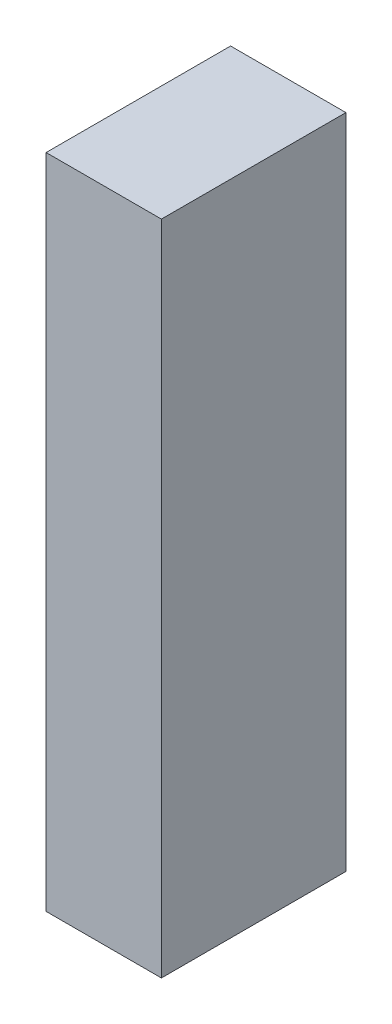
ISO-10303-21;
HEADER;
FILE_DESCRIPTION(('STEP AP214'),'2;1');
FILE_NAME('part.step','',(''),(''),'','','');
FILE_SCHEMA(('AUTOMOTIVE_DESIGN { 1 0 10303 214 1 1 1 1 }'));
ENDSEC;
DATA;
#1=APPLICATION_CONTEXT('core data for automotive mechanical design processes');
#2=APPLICATION_PROTOCOL_DEFINITION('international standard','automotive_design',2000,#1);
#3=PRODUCT_CONTEXT('',#1,'mechanical');
#4=PRODUCT('Part','Part','',(#3));
#5=PRODUCT_RELATED_PRODUCT_CATEGORY('part','',(#4));
#6=PRODUCT_DEFINITION_FORMATION('','',#4);
#7=PRODUCT_DEFINITION_CONTEXT('part definition',#1,'design');
#8=PRODUCT_DEFINITION('design','',#6,#7);
#9=PRODUCT_DEFINITION_SHAPE('','',#8);
#10=(LENGTH_UNIT() NAMED_UNIT(*) SI_UNIT(.MILLI.,.METRE.));
#11=(NAMED_UNIT(*) PLANE_ANGLE_UNIT() SI_UNIT($,.RADIAN.));
#12=(NAMED_UNIT(*) SI_UNIT($,.STERADIAN.) SOLID_ANGLE_UNIT());
#13=UNCERTAINTY_MEASURE_WITH_UNIT(LENGTH_MEASURE(1.E-05),#10,'distance_accuracy_value','');
#14=(GEOMETRIC_REPRESENTATION_CONTEXT(3) GLOBAL_UNCERTAINTY_ASSIGNED_CONTEXT((#13)) GLOBAL_UNIT_ASSIGNED_CONTEXT((#10,
#11,#12)) REPRESENTATION_CONTEXT('',''));
#15=CARTESIAN_POINT('',(0.,0.,0.));
#16=DIRECTION('',(0.,0.,1.));
#17=DIRECTION('',(1.,0.,0.));
#18=AXIS2_PLACEMENT_3D('',#15,#16,#17);
#19=CARTESIAN_POINT('',(300.,1120.,-760.));
#20=DIRECTION('',(-1.,0.,0.));
#21=DIRECTION('',(0.,0.,1.));
#22=AXIS2_PLACEMENT_3D('',#19,#20,#21);
#23=PLANE('',#22);
#24=DIRECTION('',(0.,-1.,0.));
#25=VECTOR('',#24,1.);
#26=CARTESIAN_POINT('',(300.,1120.,-600.));
#27=LINE('',#26,#25);
#28=CARTESIAN_POINT('',(300.,1690.,-600.));
#29=VERTEX_POINT('',#28);
#30=CARTESIAN_POINT('',(300.,1120.,-600.));
#31=VERTEX_POINT('',#30);
#32=EDGE_CURVE('E103',#29,#31,#27,.T.);
#33=ORIENTED_EDGE('',*,*,#32,.F.);
#34=DIRECTION('',(0.,0.,1.));
#35=VECTOR('',#34,1.);
#36=CARTESIAN_POINT('',(300.,1690.,-760.));
#37=LINE('',#36,#35);
#38=CARTESIAN_POINT('',(300.,1690.,-760.));
#39=VERTEX_POINT('',#38);
#40=EDGE_CURVE('E11',#39,#29,#37,.T.);
#41=ORIENTED_EDGE('',*,*,#40,.F.);
#42=DIRECTION('',(0.,-1.,0.));
#43=VECTOR('',#42,1.);
#44=CARTESIAN_POINT('',(300.,1120.,-760.));
#45=LINE('',#44,#43);
#46=CARTESIAN_POINT('',(300.,1120.,-760.));
#47=VERTEX_POINT('',#46);
#48=EDGE_CURVE('E97',#39,#47,#45,.T.);
#49=ORIENTED_EDGE('',*,*,#48,.T.);
#50=DIRECTION('',(0.,0.,1.));
#51=VECTOR('',#50,1.);
#52=CARTESIAN_POINT('',(300.,1120.,-760.));
#53=LINE('',#52,#51);
#54=EDGE_CURVE('E42',#47,#31,#53,.T.);
#55=ORIENTED_EDGE('',*,*,#54,.T.);
#56=EDGE_LOOP('',(#33,#41,#49,#55));
#57=FACE_BOUND('',#56,.T.);
#58=ADVANCED_FACE('F39',(#57),#23,.T.);
#59=CARTESIAN_POINT('',(300.,1690.,-760.));
#60=DIRECTION('',(0.,1.,0.));
#61=DIRECTION('',(0.,0.,1.));
#62=AXIS2_PLACEMENT_3D('',#59,#60,#61);
#63=PLANE('',#62);
#64=DIRECTION('',(-1.,0.,0.));
#65=VECTOR('',#64,1.);
#66=CARTESIAN_POINT('',(300.,1690.,-600.));
#67=LINE('',#66,#65);
#68=CARTESIAN_POINT('',(400.,1690.,-600.));
#69=VERTEX_POINT('',#68);
#70=EDGE_CURVE('E99',#69,#29,#67,.T.);
#71=ORIENTED_EDGE('',*,*,#70,.F.);
#72=DIRECTION('',(0.,0.,1.));
#73=VECTOR('',#72,1.);
#74=CARTESIAN_POINT('',(400.,1690.,-760.));
#75=LINE('',#74,#73);
#76=CARTESIAN_POINT('',(400.,1690.,-760.));
#77=VERTEX_POINT('',#76);
#78=EDGE_CURVE('E48',#77,#69,#75,.T.);
#79=ORIENTED_EDGE('',*,*,#78,.F.);
#80=DIRECTION('',(-1.,0.,0.));
#81=VECTOR('',#80,1.);
#82=CARTESIAN_POINT('',(300.,1690.,-760.));
#83=LINE('',#82,#81);
#84=EDGE_CURVE('E94',#77,#39,#83,.T.);
#85=ORIENTED_EDGE('',*,*,#84,.T.);
#86=ORIENTED_EDGE('',*,*,#40,.T.);
#87=EDGE_LOOP('',(#71,#79,#85,#86));
#88=FACE_BOUND('',#87,.T.);
#89=ADVANCED_FACE('F113',(#88),#63,.T.);
#90=CARTESIAN_POINT('',(400.,1120.,-760.));
#91=DIRECTION('',(1.,0.,0.));
#92=DIRECTION('',(0.,0.,-1.));
#93=AXIS2_PLACEMENT_3D('',#90,#91,#92);
#94=PLANE('',#93);
#95=DIRECTION('',(0.,1.,0.));
#96=VECTOR('',#95,1.);
#97=CARTESIAN_POINT('',(400.,1120.,-600.));
#98=LINE('',#97,#96);
#99=CARTESIAN_POINT('',(400.,1120.,-600.));
#100=VERTEX_POINT('',#99);
#101=EDGE_CURVE('E89',#100,#69,#98,.T.);
#102=ORIENTED_EDGE('',*,*,#101,.F.);
#103=DIRECTION('',(0.,0.,1.));
#104=VECTOR('',#103,1.);
#105=CARTESIAN_POINT('',(400.,1120.,-760.));
#106=LINE('',#105,#104);
#107=CARTESIAN_POINT('',(400.,1120.,-760.));
#108=VERTEX_POINT('',#107);
#109=EDGE_CURVE('E84',#108,#100,#106,.T.);
#110=ORIENTED_EDGE('',*,*,#109,.F.);
#111=DIRECTION('',(0.,1.,0.));
#112=VECTOR('',#111,1.);
#113=CARTESIAN_POINT('',(400.,1120.,-760.));
#114=LINE('',#113,#112);
#115=EDGE_CURVE('E87',#108,#77,#114,.T.);
#116=ORIENTED_EDGE('',*,*,#115,.T.);
#117=ORIENTED_EDGE('',*,*,#78,.T.);
#118=EDGE_LOOP('',(#102,#110,#116,#117));
#119=FACE_BOUND('',#118,.T.);
#120=ADVANCED_FACE('F86',(#119),#94,.T.);
#121=CARTESIAN_POINT('',(300.,1120.,-760.));
#122=DIRECTION('',(0.,-1.,0.));
#123=DIRECTION('',(0.,0.,-1.));
#124=AXIS2_PLACEMENT_3D('',#121,#122,#123);
#125=PLANE('',#124);
#126=DIRECTION('',(1.,0.,0.));
#127=VECTOR('',#126,1.);
#128=CARTESIAN_POINT('',(300.,1120.,-600.));
#129=LINE('',#128,#127);
#130=EDGE_CURVE('E106',#31,#100,#129,.T.);
#131=ORIENTED_EDGE('',*,*,#130,.F.);
#132=ORIENTED_EDGE('',*,*,#54,.F.);
#133=DIRECTION('',(1.,0.,0.));
#134=VECTOR('',#133,1.);
#135=CARTESIAN_POINT('',(300.,1120.,-760.));
#136=LINE('',#135,#134);
#137=EDGE_CURVE('E93',#47,#108,#136,.T.);
#138=ORIENTED_EDGE('',*,*,#137,.T.);
#139=ORIENTED_EDGE('',*,*,#109,.T.);
#140=EDGE_LOOP('',(#131,#132,#138,#139));
#141=FACE_BOUND('',#140,.T.);
#142=ADVANCED_FACE('F96',(#141),#125,.T.);
#143=CARTESIAN_POINT('',(0.,0.,-760.));
#144=DIRECTION('',(0.,0.,-1.));
#145=DIRECTION('',(-1.,0.,0.));
#146=AXIS2_PLACEMENT_3D('',#143,#144,#145);
#147=PLANE('',#146);
#148=ORIENTED_EDGE('',*,*,#48,.F.);
#149=ORIENTED_EDGE('',*,*,#84,.F.);
#150=ORIENTED_EDGE('',*,*,#115,.F.);
#151=ORIENTED_EDGE('',*,*,#137,.F.);
#152=EDGE_LOOP('',(#148,#149,#150,#151));
#153=FACE_BOUND('',#152,.T.);
#154=ADVANCED_FACE('F92',(#153),#147,.T.);
#155=CARTESIAN_POINT('',(0.,0.,-600.));
#156=DIRECTION('',(0.,0.,-1.));
#157=DIRECTION('',(-1.,0.,0.));
#158=AXIS2_PLACEMENT_3D('',#155,#156,#157);
#159=PLANE('',#158);
#160=ORIENTED_EDGE('',*,*,#32,.T.);
#161=ORIENTED_EDGE('',*,*,#130,.T.);
#162=ORIENTED_EDGE('',*,*,#101,.T.);
#163=ORIENTED_EDGE('',*,*,#70,.T.);
#164=EDGE_LOOP('',(#160,#161,#162,#163));
#165=FACE_BOUND('',#164,.T.);
#166=ADVANCED_FACE('F112',(#165),#159,.F.);
#167=CLOSED_SHELL('',(#58,#89,#120,#142,#154,#166));
#168=MANIFOLD_SOLID_BREP('B2',#167);
#169=ADVANCED_BREP_SHAPE_REPRESENTATION('',(#18,#168),#14);
#170=SHAPE_DEFINITION_REPRESENTATION(#9,#169);
ENDSEC;
END-ISO-10303-21;
